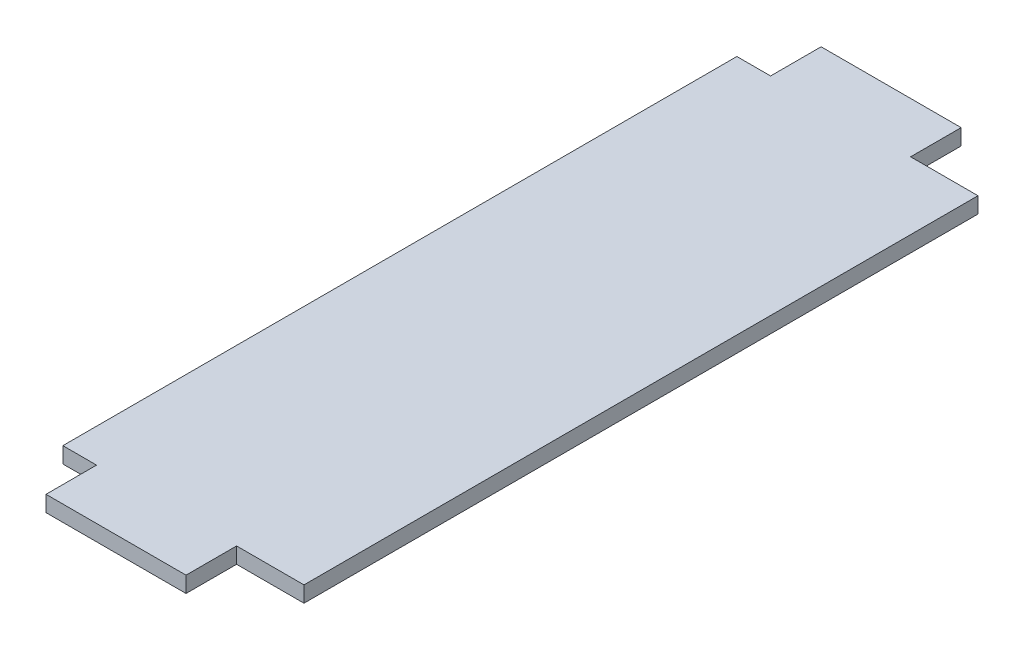
ISO-10303-21;
HEADER;
FILE_DESCRIPTION(('STEP AP214'),'2;1');
FILE_NAME('part.step','',(''),(''),'','','');
FILE_SCHEMA(('AUTOMOTIVE_DESIGN { 1 0 10303 214 1 1 1 1 }'));
ENDSEC;
DATA;
#1=APPLICATION_CONTEXT('core data for automotive mechanical design processes');
#2=APPLICATION_PROTOCOL_DEFINITION('international standard','automotive_design',2000,#1);
#3=PRODUCT_CONTEXT('',#1,'mechanical');
#4=PRODUCT('Part','Part','',(#3));
#5=PRODUCT_RELATED_PRODUCT_CATEGORY('part','',(#4));
#6=PRODUCT_DEFINITION_FORMATION('','',#4);
#7=PRODUCT_DEFINITION_CONTEXT('part definition',#1,'design');
#8=PRODUCT_DEFINITION('design','',#6,#7);
#9=PRODUCT_DEFINITION_SHAPE('','',#8);
#10=(LENGTH_UNIT() NAMED_UNIT(*) SI_UNIT(.MILLI.,.METRE.));
#11=(NAMED_UNIT(*) PLANE_ANGLE_UNIT() SI_UNIT($,.RADIAN.));
#12=(NAMED_UNIT(*) SI_UNIT($,.STERADIAN.) SOLID_ANGLE_UNIT());
#13=UNCERTAINTY_MEASURE_WITH_UNIT(LENGTH_MEASURE(1.E-05),#10,'distance_accuracy_value','');
#14=(GEOMETRIC_REPRESENTATION_CONTEXT(3) GLOBAL_UNCERTAINTY_ASSIGNED_CONTEXT((#13)) GLOBAL_UNIT_ASSIGNED_CONTEXT((#10,
#11,#12)) REPRESENTATION_CONTEXT('',''));
#15=CARTESIAN_POINT('',(0.,0.,0.));
#16=DIRECTION('',(0.,0.,1.));
#17=DIRECTION('',(1.,0.,0.));
#18=AXIS2_PLACEMENT_3D('',#15,#16,#17);
#19=CARTESIAN_POINT('',(10.0168456000001,2.9972,0.));
#20=DIRECTION('',(1.,0.,0.));
#21=DIRECTION('',(0.,0.,-1.));
#22=AXIS2_PLACEMENT_3D('',#19,#20,#21);
#23=PLANE('',#22);
#24=DIRECTION('',(0.,0.,1.));
#25=VECTOR('',#24,1.);
#26=CARTESIAN_POINT('',(10.0168456000001,0.,0.));
#27=LINE('',#26,#25);
#28=CARTESIAN_POINT('',(10.0168456000001,0.,-73.025));
#29=VERTEX_POINT('',#28);
#30=CARTESIAN_POINT('',(10.0168456000001,0.,-63.5));
#31=VERTEX_POINT('',#30);
#32=EDGE_CURVE('E166',#29,#31,#27,.T.);
#33=ORIENTED_EDGE('',*,*,#32,.F.);
#34=DIRECTION('',(0.,-1.,0.));
#35=VECTOR('',#34,1.);
#36=CARTESIAN_POINT('',(10.0168456000001,2.9972,-73.025));
#37=LINE('',#36,#35);
#38=CARTESIAN_POINT('',(10.0168456000001,2.9972,-73.025));
#39=VERTEX_POINT('',#38);
#40=EDGE_CURVE('E11',#39,#29,#37,.T.);
#41=ORIENTED_EDGE('',*,*,#40,.F.);
#42=DIRECTION('',(0.,0.,1.));
#43=VECTOR('',#42,1.);
#44=CARTESIAN_POINT('',(10.0168456000001,2.9972,0.));
#45=LINE('',#44,#43);
#46=CARTESIAN_POINT('',(10.0168456000001,2.9972,-63.5));
#47=VERTEX_POINT('',#46);
#48=EDGE_CURVE('E208',#39,#47,#45,.T.);
#49=ORIENTED_EDGE('',*,*,#48,.T.);
#50=DIRECTION('',(0.,-1.,0.));
#51=VECTOR('',#50,1.);
#52=CARTESIAN_POINT('',(10.0168456000001,2.9972,-63.5));
#53=LINE('',#52,#51);
#54=EDGE_CURVE('E104',#47,#31,#53,.T.);
#55=ORIENTED_EDGE('',*,*,#54,.T.);
#56=EDGE_LOOP('',(#33,#41,#49,#55));
#57=FACE_BOUND('',#56,.T.);
#58=ADVANCED_FACE('F41',(#57),#23,.T.);
#59=CARTESIAN_POINT('',(0.,2.9972,-73.025));
#60=DIRECTION('',(0.,0.,1.));
#61=DIRECTION('',(1.,0.,0.));
#62=AXIS2_PLACEMENT_3D('',#59,#60,#61);
#63=PLANE('',#62);
#64=DIRECTION('',(-1.,0.,0.));
#65=VECTOR('',#64,1.);
#66=CARTESIAN_POINT('',(0.,0.,-73.025));
#67=LINE('',#66,#65);
#68=CARTESIAN_POINT('',(-16.3668455999999,0.,-73.025));
#69=VERTEX_POINT('',#68);
#70=EDGE_CURVE('E170',#29,#69,#67,.T.);
#71=ORIENTED_EDGE('',*,*,#70,.T.);
#72=DIRECTION('',(0.,-1.,0.));
#73=VECTOR('',#72,1.);
#74=CARTESIAN_POINT('',(-16.3668455999999,2.9972,-73.025));
#75=LINE('',#74,#73);
#76=CARTESIAN_POINT('',(-16.3668455999999,2.9972,-73.025));
#77=VERTEX_POINT('',#76);
#78=EDGE_CURVE('E50',#77,#69,#75,.T.);
#79=ORIENTED_EDGE('',*,*,#78,.F.);
#80=DIRECTION('',(-1.,0.,0.));
#81=VECTOR('',#80,1.);
#82=CARTESIAN_POINT('',(0.,2.9972,-73.025));
#83=LINE('',#82,#81);
#84=EDGE_CURVE('E262',#39,#77,#83,.T.);
#85=ORIENTED_EDGE('',*,*,#84,.F.);
#86=ORIENTED_EDGE('',*,*,#40,.T.);
#87=EDGE_LOOP('',(#71,#79,#85,#86));
#88=FACE_BOUND('',#87,.T.);
#89=ADVANCED_FACE('F294',(#88),#63,.F.);
#90=CARTESIAN_POINT('',(-16.3668455999999,2.9972,0.));
#91=DIRECTION('',(1.,0.,0.));
#92=DIRECTION('',(0.,0.,-1.));
#93=AXIS2_PLACEMENT_3D('',#90,#91,#92);
#94=PLANE('',#93);
#95=DIRECTION('',(0.,0.,1.));
#96=VECTOR('',#95,1.);
#97=CARTESIAN_POINT('',(-16.3668455999999,0.,0.));
#98=LINE('',#97,#96);
#99=CARTESIAN_POINT('',(-16.3668455999999,0.,-63.5));
#100=VERTEX_POINT('',#99);
#101=EDGE_CURVE('E173',#69,#100,#98,.T.);
#102=ORIENTED_EDGE('',*,*,#101,.T.);
#103=DIRECTION('',(0.,-1.,0.));
#104=VECTOR('',#103,1.);
#105=CARTESIAN_POINT('',(-16.3668455999999,2.9972,-63.5));
#106=LINE('',#105,#104);
#107=CARTESIAN_POINT('',(-16.3668455999999,2.9972,-63.5));
#108=VERTEX_POINT('',#107);
#109=EDGE_CURVE('E230',#108,#100,#106,.T.);
#110=ORIENTED_EDGE('',*,*,#109,.F.);
#111=DIRECTION('',(0.,0.,1.));
#112=VECTOR('',#111,1.);
#113=CARTESIAN_POINT('',(-16.3668455999999,2.9972,0.));
#114=LINE('',#113,#112);
#115=EDGE_CURVE('E240',#77,#108,#114,.T.);
#116=ORIENTED_EDGE('',*,*,#115,.F.);
#117=ORIENTED_EDGE('',*,*,#78,.T.);
#118=EDGE_LOOP('',(#102,#110,#116,#117));
#119=FACE_BOUND('',#118,.T.);
#120=ADVANCED_FACE('F238',(#119),#94,.F.);
#121=CARTESIAN_POINT('',(0.,2.9972,-63.5));
#122=DIRECTION('',(0.,0.,-1.));
#123=DIRECTION('',(-1.,0.,0.));
#124=AXIS2_PLACEMENT_3D('',#121,#122,#123);
#125=PLANE('',#124);
#126=DIRECTION('',(1.,0.,0.));
#127=VECTOR('',#126,1.);
#128=CARTESIAN_POINT('',(0.,0.,-63.5));
#129=LINE('',#128,#127);
#130=CARTESIAN_POINT('',(-22.7168455999999,0.,-63.5));
#131=VERTEX_POINT('',#130);
#132=EDGE_CURVE('E177',#131,#100,#129,.T.);
#133=ORIENTED_EDGE('',*,*,#132,.F.);
#134=DIRECTION('',(0.,-1.,0.));
#135=VECTOR('',#134,1.);
#136=CARTESIAN_POINT('',(-22.7168455999999,2.9972,-63.5));
#137=LINE('',#136,#135);
#138=CARTESIAN_POINT('',(-22.7168455999999,2.9972,-63.5));
#139=VERTEX_POINT('',#138);
#140=EDGE_CURVE('E227',#139,#131,#137,.T.);
#141=ORIENTED_EDGE('',*,*,#140,.F.);
#142=DIRECTION('',(1.,0.,0.));
#143=VECTOR('',#142,1.);
#144=CARTESIAN_POINT('',(0.,2.9972,-63.5));
#145=LINE('',#144,#143);
#146=EDGE_CURVE('E252',#139,#108,#145,.T.);
#147=ORIENTED_EDGE('',*,*,#146,.T.);
#148=ORIENTED_EDGE('',*,*,#109,.T.);
#149=EDGE_LOOP('',(#133,#141,#147,#148));
#150=FACE_BOUND('',#149,.T.);
#151=ADVANCED_FACE('F249',(#150),#125,.T.);
#152=CARTESIAN_POINT('',(-22.7168455999999,2.9972,0.));
#153=DIRECTION('',(-1.,0.,0.));
#154=DIRECTION('',(0.,0.,1.));
#155=AXIS2_PLACEMENT_3D('',#152,#153,#154);
#156=PLANE('',#155);
#157=DIRECTION('',(0.,0.,-1.));
#158=VECTOR('',#157,1.);
#159=CARTESIAN_POINT('',(-22.7168455999999,0.,0.));
#160=LINE('',#159,#158);
#161=CARTESIAN_POINT('',(-22.7168455999999,0.,63.5));
#162=VERTEX_POINT('',#161);
#163=EDGE_CURVE('E181',#162,#131,#160,.T.);
#164=ORIENTED_EDGE('',*,*,#163,.F.);
#165=DIRECTION('',(0.,-1.,0.));
#166=VECTOR('',#165,1.);
#167=CARTESIAN_POINT('',(-22.7168455999999,2.9972,63.5));
#168=LINE('',#167,#166);
#169=CARTESIAN_POINT('',(-22.7168455999999,2.9972,63.5));
#170=VERTEX_POINT('',#169);
#171=EDGE_CURVE('E224',#170,#162,#168,.T.);
#172=ORIENTED_EDGE('',*,*,#171,.F.);
#173=DIRECTION('',(0.,0.,-1.));
#174=VECTOR('',#173,1.);
#175=CARTESIAN_POINT('',(-22.7168455999999,2.9972,0.));
#176=LINE('',#175,#174);
#177=EDGE_CURVE('E256',#170,#139,#176,.T.);
#178=ORIENTED_EDGE('',*,*,#177,.T.);
#179=ORIENTED_EDGE('',*,*,#140,.T.);
#180=EDGE_LOOP('',(#164,#172,#178,#179));
#181=FACE_BOUND('',#180,.T.);
#182=ADVANCED_FACE('F364',(#181),#156,.T.);
#183=CARTESIAN_POINT('',(0.,2.9972,63.5));
#184=DIRECTION('',(0.,0.,-1.));
#185=DIRECTION('',(-1.,0.,0.));
#186=AXIS2_PLACEMENT_3D('',#183,#184,#185);
#187=PLANE('',#186);
#188=DIRECTION('',(1.,0.,0.));
#189=VECTOR('',#188,1.);
#190=CARTESIAN_POINT('',(0.,0.,63.5));
#191=LINE('',#190,#189);
#192=CARTESIAN_POINT('',(-16.3668455999999,0.,63.5));
#193=VERTEX_POINT('',#192);
#194=EDGE_CURVE('E185',#162,#193,#191,.T.);
#195=ORIENTED_EDGE('',*,*,#194,.T.);
#196=DIRECTION('',(0.,-1.,0.));
#197=VECTOR('',#196,1.);
#198=CARTESIAN_POINT('',(-16.3668455999999,2.9972,63.5));
#199=LINE('',#198,#197);
#200=CARTESIAN_POINT('',(-16.3668455999999,2.9972,63.5));
#201=VERTEX_POINT('',#200);
#202=EDGE_CURVE('E221',#201,#193,#199,.T.);
#203=ORIENTED_EDGE('',*,*,#202,.F.);
#204=DIRECTION('',(1.,0.,0.));
#205=VECTOR('',#204,1.);
#206=CARTESIAN_POINT('',(0.,2.9972,63.5));
#207=LINE('',#206,#205);
#208=EDGE_CURVE('E260',#170,#201,#207,.T.);
#209=ORIENTED_EDGE('',*,*,#208,.F.);
#210=ORIENTED_EDGE('',*,*,#171,.T.);
#211=EDGE_LOOP('',(#195,#203,#209,#210));
#212=FACE_BOUND('',#211,.T.);
#213=ADVANCED_FACE('F355',(#212),#187,.F.);
#214=CARTESIAN_POINT('',(-16.3668455999999,2.9972,0.));
#215=DIRECTION('',(-1.,0.,0.));
#216=DIRECTION('',(0.,0.,1.));
#217=AXIS2_PLACEMENT_3D('',#214,#215,#216);
#218=PLANE('',#217);
#219=DIRECTION('',(0.,0.,-1.));
#220=VECTOR('',#219,1.);
#221=CARTESIAN_POINT('',(-16.3668455999999,0.,0.));
#222=LINE('',#221,#220);
#223=CARTESIAN_POINT('',(-16.3668455999999,0.,73.025));
#224=VERTEX_POINT('',#223);
#225=EDGE_CURVE('E189',#224,#193,#222,.T.);
#226=ORIENTED_EDGE('',*,*,#225,.F.);
#227=DIRECTION('',(0.,-1.,0.));
#228=VECTOR('',#227,1.);
#229=CARTESIAN_POINT('',(-16.3668455999999,2.9972,73.025));
#230=LINE('',#229,#228);
#231=CARTESIAN_POINT('',(-16.3668455999999,2.9972,73.025));
#232=VERTEX_POINT('',#231);
#233=EDGE_CURVE('E218',#232,#224,#230,.T.);
#234=ORIENTED_EDGE('',*,*,#233,.F.);
#235=DIRECTION('',(0.,0.,-1.));
#236=VECTOR('',#235,1.);
#237=CARTESIAN_POINT('',(-16.3668455999999,2.9972,0.));
#238=LINE('',#237,#236);
#239=EDGE_CURVE('E268',#232,#201,#238,.T.);
#240=ORIENTED_EDGE('',*,*,#239,.T.);
#241=ORIENTED_EDGE('',*,*,#202,.T.);
#242=EDGE_LOOP('',(#226,#234,#240,#241));
#243=FACE_BOUND('',#242,.T.);
#244=ADVANCED_FACE('F281',(#243),#218,.T.);
#245=CARTESIAN_POINT('',(0.,2.9972,73.025));
#246=DIRECTION('',(0.,0.,1.));
#247=DIRECTION('',(1.,0.,0.));
#248=AXIS2_PLACEMENT_3D('',#245,#246,#247);
#249=PLANE('',#248);
#250=DIRECTION('',(-1.,0.,0.));
#251=VECTOR('',#250,1.);
#252=CARTESIAN_POINT('',(0.,0.,73.025));
#253=LINE('',#252,#251);
#254=CARTESIAN_POINT('',(10.0168456000001,0.,73.025));
#255=VERTEX_POINT('',#254);
#256=EDGE_CURVE('E193',#255,#224,#253,.T.);
#257=ORIENTED_EDGE('',*,*,#256,.F.);
#258=DIRECTION('',(0.,-1.,0.));
#259=VECTOR('',#258,1.);
#260=CARTESIAN_POINT('',(10.0168456000001,2.9972,73.025));
#261=LINE('',#260,#259);
#262=CARTESIAN_POINT('',(10.0168456000001,2.9972,73.025));
#263=VERTEX_POINT('',#262);
#264=EDGE_CURVE('E215',#263,#255,#261,.T.);
#265=ORIENTED_EDGE('',*,*,#264,.F.);
#266=DIRECTION('',(-1.,0.,0.));
#267=VECTOR('',#266,1.);
#268=CARTESIAN_POINT('',(0.,2.9972,73.025));
#269=LINE('',#268,#267);
#270=EDGE_CURVE('E160',#263,#232,#269,.T.);
#271=ORIENTED_EDGE('',*,*,#270,.T.);
#272=ORIENTED_EDGE('',*,*,#233,.T.);
#273=EDGE_LOOP('',(#257,#265,#271,#272));
#274=FACE_BOUND('',#273,.T.);
#275=ADVANCED_FACE('F275',(#274),#249,.T.);
#276=CARTESIAN_POINT('',(10.0168456000001,2.9972,0.));
#277=DIRECTION('',(-1.,0.,0.));
#278=DIRECTION('',(0.,0.,1.));
#279=AXIS2_PLACEMENT_3D('',#276,#277,#278);
#280=PLANE('',#279);
#281=DIRECTION('',(0.,0.,-1.));
#282=VECTOR('',#281,1.);
#283=CARTESIAN_POINT('',(10.0168456000001,0.,0.));
#284=LINE('',#283,#282);
#285=CARTESIAN_POINT('',(10.0168456000001,0.,63.5));
#286=VERTEX_POINT('',#285);
#287=EDGE_CURVE('E197',#255,#286,#284,.T.);
#288=ORIENTED_EDGE('',*,*,#287,.T.);
#289=DIRECTION('',(0.,-1.,0.));
#290=VECTOR('',#289,1.);
#291=CARTESIAN_POINT('',(10.0168456000001,2.9972,63.5));
#292=LINE('',#291,#290);
#293=CARTESIAN_POINT('',(10.0168456000001,2.9972,63.5));
#294=VERTEX_POINT('',#293);
#295=EDGE_CURVE('E145',#294,#286,#292,.T.);
#296=ORIENTED_EDGE('',*,*,#295,.F.);
#297=DIRECTION('',(0.,0.,-1.));
#298=VECTOR('',#297,1.);
#299=CARTESIAN_POINT('',(10.0168456000001,2.9972,0.));
#300=LINE('',#299,#298);
#301=EDGE_CURVE('E155',#263,#294,#300,.T.);
#302=ORIENTED_EDGE('',*,*,#301,.F.);
#303=ORIENTED_EDGE('',*,*,#264,.T.);
#304=EDGE_LOOP('',(#288,#296,#302,#303));
#305=FACE_BOUND('',#304,.T.);
#306=ADVANCED_FACE('F284',(#305),#280,.F.);
#307=CARTESIAN_POINT('',(0.,2.9972,63.5));
#308=DIRECTION('',(0.,0.,1.));
#309=DIRECTION('',(1.,0.,0.));
#310=AXIS2_PLACEMENT_3D('',#307,#308,#309);
#311=PLANE('',#310);
#312=DIRECTION('',(-1.,0.,0.));
#313=VECTOR('',#312,1.);
#314=CARTESIAN_POINT('',(0.,0.,63.5));
#315=LINE('',#314,#313);
#316=CARTESIAN_POINT('',(22.7168456000001,0.,63.5));
#317=VERTEX_POINT('',#316);
#318=EDGE_CURVE('E143',#317,#286,#315,.T.);
#319=ORIENTED_EDGE('',*,*,#318,.F.);
#320=DIRECTION('',(0.,-1.,0.));
#321=VECTOR('',#320,1.);
#322=CARTESIAN_POINT('',(22.7168456000001,2.9972,63.5));
#323=LINE('',#322,#321);
#324=CARTESIAN_POINT('',(22.7168456000001,2.9972,63.5));
#325=VERTEX_POINT('',#324);
#326=EDGE_CURVE('E137',#325,#317,#323,.T.);
#327=ORIENTED_EDGE('',*,*,#326,.F.);
#328=DIRECTION('',(-1.,0.,0.));
#329=VECTOR('',#328,1.);
#330=CARTESIAN_POINT('',(0.,2.9972,63.5));
#331=LINE('',#330,#329);
#332=EDGE_CURVE('E141',#325,#294,#331,.T.);
#333=ORIENTED_EDGE('',*,*,#332,.T.);
#334=ORIENTED_EDGE('',*,*,#295,.T.);
#335=EDGE_LOOP('',(#319,#327,#333,#334));
#336=FACE_BOUND('',#335,.T.);
#337=ADVANCED_FACE('F139',(#336),#311,.T.);
#338=CARTESIAN_POINT('',(22.7168456000001,2.9972,0.));
#339=DIRECTION('',(-1.,0.,0.));
#340=DIRECTION('',(0.,0.,1.));
#341=AXIS2_PLACEMENT_3D('',#338,#339,#340);
#342=PLANE('',#341);
#343=DIRECTION('',(0.,0.,-1.));
#344=VECTOR('',#343,1.);
#345=CARTESIAN_POINT('',(22.7168456000001,0.,0.));
#346=LINE('',#345,#344);
#347=CARTESIAN_POINT('',(22.7168456000001,0.,-63.5));
#348=VERTEX_POINT('',#347);
#349=EDGE_CURVE('E97',#317,#348,#346,.T.);
#350=ORIENTED_EDGE('',*,*,#349,.T.);
#351=DIRECTION('',(0.,-1.,0.));
#352=VECTOR('',#351,1.);
#353=CARTESIAN_POINT('',(22.7168456000001,2.9972,-63.5));
#354=LINE('',#353,#352);
#355=CARTESIAN_POINT('',(22.7168456000001,2.9972,-63.5));
#356=VERTEX_POINT('',#355);
#357=EDGE_CURVE('E146',#356,#348,#354,.T.);
#358=ORIENTED_EDGE('',*,*,#357,.F.);
#359=DIRECTION('',(0.,0.,-1.));
#360=VECTOR('',#359,1.);
#361=CARTESIAN_POINT('',(22.7168456000001,2.9972,0.));
#362=LINE('',#361,#360);
#363=EDGE_CURVE('E148',#325,#356,#362,.T.);
#364=ORIENTED_EDGE('',*,*,#363,.F.);
#365=ORIENTED_EDGE('',*,*,#326,.T.);
#366=EDGE_LOOP('',(#350,#358,#364,#365));
#367=FACE_BOUND('',#366,.T.);
#368=ADVANCED_FACE('F149',(#367),#342,.F.);
#369=CARTESIAN_POINT('',(0.,2.9972,-63.5));
#370=DIRECTION('',(0.,0.,1.));
#371=DIRECTION('',(1.,0.,0.));
#372=AXIS2_PLACEMENT_3D('',#369,#370,#371);
#373=PLANE('',#372);
#374=DIRECTION('',(-1.,0.,0.));
#375=VECTOR('',#374,1.);
#376=CARTESIAN_POINT('',(0.,0.,-63.5));
#377=LINE('',#376,#375);
#378=EDGE_CURVE('E205',#348,#31,#377,.T.);
#379=ORIENTED_EDGE('',*,*,#378,.T.);
#380=ORIENTED_EDGE('',*,*,#54,.F.);
#381=DIRECTION('',(-1.,0.,0.));
#382=VECTOR('',#381,1.);
#383=CARTESIAN_POINT('',(0.,2.9972,-63.5));
#384=LINE('',#383,#382);
#385=EDGE_CURVE('E58',#356,#47,#384,.T.);
#386=ORIENTED_EDGE('',*,*,#385,.F.);
#387=ORIENTED_EDGE('',*,*,#357,.T.);
#388=EDGE_LOOP('',(#379,#380,#386,#387));
#389=FACE_BOUND('',#388,.T.);
#390=ADVANCED_FACE('F300',(#389),#373,.F.);
#391=CARTESIAN_POINT('',(0.,2.9972,0.));
#392=DIRECTION('',(0.,1.,0.));
#393=DIRECTION('',(0.,0.,1.));
#394=AXIS2_PLACEMENT_3D('',#391,#392,#393);
#395=PLANE('',#394);
#396=ORIENTED_EDGE('',*,*,#48,.F.);
#397=ORIENTED_EDGE('',*,*,#84,.T.);
#398=ORIENTED_EDGE('',*,*,#115,.T.);
#399=ORIENTED_EDGE('',*,*,#146,.F.);
#400=ORIENTED_EDGE('',*,*,#177,.F.);
#401=ORIENTED_EDGE('',*,*,#208,.T.);
#402=ORIENTED_EDGE('',*,*,#239,.F.);
#403=ORIENTED_EDGE('',*,*,#270,.F.);
#404=ORIENTED_EDGE('',*,*,#301,.T.);
#405=ORIENTED_EDGE('',*,*,#332,.F.);
#406=ORIENTED_EDGE('',*,*,#363,.T.);
#407=ORIENTED_EDGE('',*,*,#385,.T.);
#408=EDGE_LOOP('',(#396,#397,#398,#399,#400,#401,#402,#403,#404,#405,#406,#407));
#409=FACE_BOUND('',#408,.T.);
#410=ADVANCED_FACE('F152',(#409),#395,.T.);
#411=CARTESIAN_POINT('',(0.,0.,0.));
#412=DIRECTION('',(0.,1.,0.));
#413=DIRECTION('',(0.,0.,1.));
#414=AXIS2_PLACEMENT_3D('',#411,#412,#413);
#415=PLANE('',#414);
#416=ORIENTED_EDGE('',*,*,#32,.T.);
#417=ORIENTED_EDGE('',*,*,#378,.F.);
#418=ORIENTED_EDGE('',*,*,#349,.F.);
#419=ORIENTED_EDGE('',*,*,#318,.T.);
#420=ORIENTED_EDGE('',*,*,#287,.F.);
#421=ORIENTED_EDGE('',*,*,#256,.T.);
#422=ORIENTED_EDGE('',*,*,#225,.T.);
#423=ORIENTED_EDGE('',*,*,#194,.F.);
#424=ORIENTED_EDGE('',*,*,#163,.T.);
#425=ORIENTED_EDGE('',*,*,#132,.T.);
#426=ORIENTED_EDGE('',*,*,#101,.F.);
#427=ORIENTED_EDGE('',*,*,#70,.F.);
#428=EDGE_LOOP('',(#416,#417,#418,#419,#420,#421,#422,#423,#424,#425,#426,#427));
#429=FACE_BOUND('',#428,.T.);
#430=ADVANCED_FACE('F244',(#429),#415,.F.);
#431=CLOSED_SHELL('',(#58,#89,#120,#151,#182,#213,#244,#275,#306,#337,#368,#390,#410,#430));
#432=MANIFOLD_SOLID_BREP('B2',#431);
#433=ADVANCED_BREP_SHAPE_REPRESENTATION('',(#18,#432),#14);
#434=SHAPE_DEFINITION_REPRESENTATION(#9,#433);
ENDSEC;
END-ISO-10303-21;
